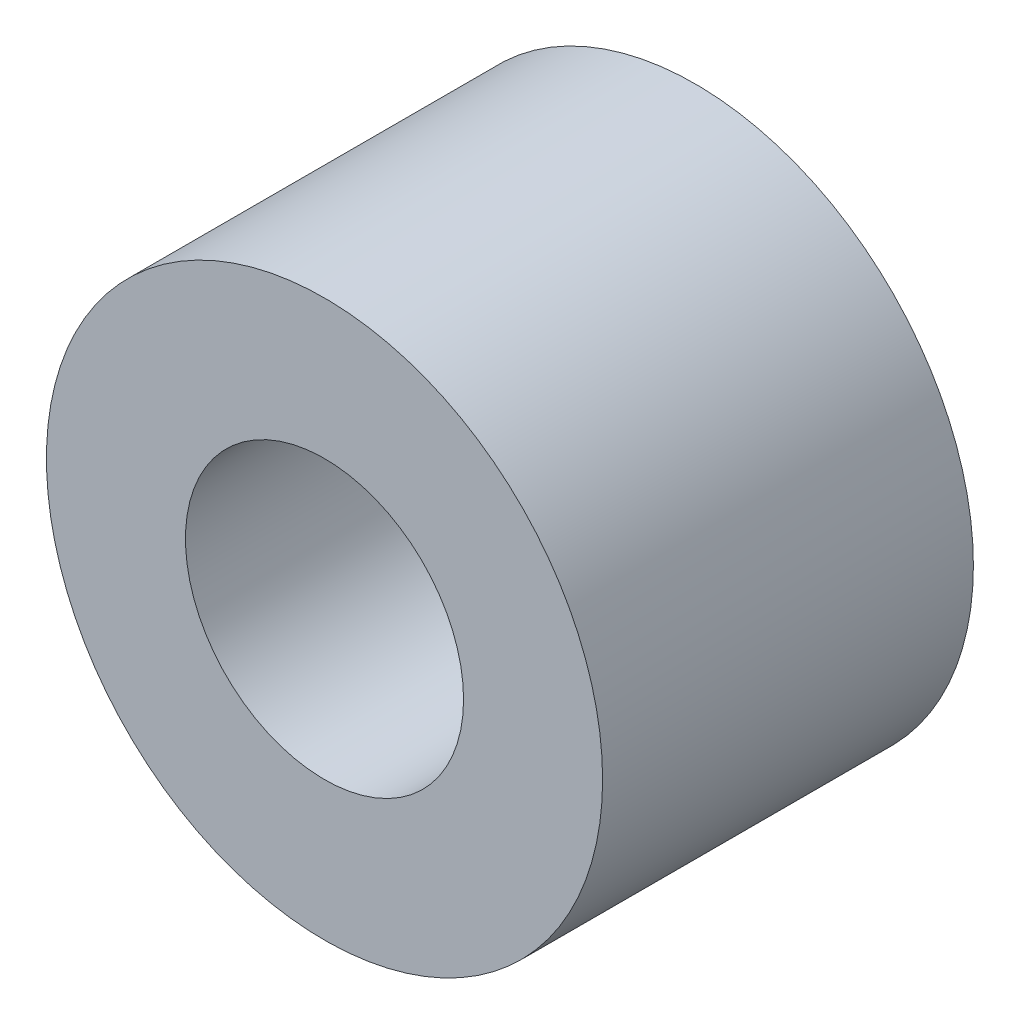
ISO-10303-21;
HEADER;
FILE_DESCRIPTION(('STEP AP214'),'2;1');
FILE_NAME('part.step','',(''),(''),'','','');
FILE_SCHEMA(('AUTOMOTIVE_DESIGN { 1 0 10303 214 1 1 1 1 }'));
ENDSEC;
DATA;
#1=APPLICATION_CONTEXT('core data for automotive mechanical design processes');
#2=APPLICATION_PROTOCOL_DEFINITION('international standard','automotive_design',2000,#1);
#3=PRODUCT_CONTEXT('',#1,'mechanical');
#4=PRODUCT('Part','Part','',(#3));
#5=PRODUCT_RELATED_PRODUCT_CATEGORY('part','',(#4));
#6=PRODUCT_DEFINITION_FORMATION('','',#4);
#7=PRODUCT_DEFINITION_CONTEXT('part definition',#1,'design');
#8=PRODUCT_DEFINITION('design','',#6,#7);
#9=PRODUCT_DEFINITION_SHAPE('','',#8);
#10=(LENGTH_UNIT() NAMED_UNIT(*) SI_UNIT(.MILLI.,.METRE.));
#11=(NAMED_UNIT(*) PLANE_ANGLE_UNIT() SI_UNIT($,.RADIAN.));
#12=(NAMED_UNIT(*) SI_UNIT($,.STERADIAN.) SOLID_ANGLE_UNIT());
#13=UNCERTAINTY_MEASURE_WITH_UNIT(LENGTH_MEASURE(1.E-05),#10,'distance_accuracy_value','');
#14=(GEOMETRIC_REPRESENTATION_CONTEXT(3) GLOBAL_UNCERTAINTY_ASSIGNED_CONTEXT((#13)) GLOBAL_UNIT_ASSIGNED_CONTEXT((#10,
#11,#12)) REPRESENTATION_CONTEXT('',''));
#15=CARTESIAN_POINT('',(0.,0.,0.));
#16=DIRECTION('',(0.,0.,1.));
#17=DIRECTION('',(1.,0.,0.));
#18=AXIS2_PLACEMENT_3D('',#15,#16,#17);
#19=CARTESIAN_POINT('',(-80.,0.00299999999998912,4.));
#20=DIRECTION('',(0.,0.,1.));
#21=DIRECTION('',(1.,0.,0.));
#22=AXIS2_PLACEMENT_3D('',#19,#20,#21);
#23=PLANE('',#22);
#24=CARTESIAN_POINT('',(-80.,0.00299999999998912,4.));
#25=DIRECTION('',(0.,0.,1.));
#26=DIRECTION('',(1.,0.,0.));
#27=AXIS2_PLACEMENT_3D('',#24,#25,#26);
#28=CIRCLE('',#27,3.00000000000001);
#29=CARTESIAN_POINT('',(-77.,0.00299999999998912,4.));
#30=VERTEX_POINT('',#29);
#31=EDGE_CURVE('E10',#30,#30,#28,.T.);
#32=ORIENTED_EDGE('',*,*,#31,.T.);
#33=EDGE_LOOP('',(#32));
#34=FACE_BOUND('',#33,.T.);
#35=CARTESIAN_POINT('',(-80.,0.00299999999998912,4.));
#36=DIRECTION('',(0.,0.,1.));
#37=DIRECTION('',(1.,0.,0.));
#38=AXIS2_PLACEMENT_3D('',#35,#36,#37);
#39=CIRCLE('',#38,1.50000000000001);
#40=CARTESIAN_POINT('',(-78.5,0.00299999999998912,4.));
#41=VERTEX_POINT('',#40);
#42=EDGE_CURVE('E44',#41,#41,#39,.T.);
#43=ORIENTED_EDGE('',*,*,#42,.F.);
#44=EDGE_LOOP('',(#43));
#45=FACE_BOUND('',#44,.T.);
#46=ADVANCED_FACE('F33',(#34,#45),#23,.T.);
#47=CARTESIAN_POINT('',(-80.,0.00299999999998912,0.));
#48=DIRECTION('',(0.,0.,1.));
#49=DIRECTION('',(1.,0.,0.));
#50=AXIS2_PLACEMENT_3D('',#47,#48,#49);
#51=PLANE('',#50);
#52=CARTESIAN_POINT('',(-80.,0.00299999999998912,0.));
#53=DIRECTION('',(0.,0.,1.));
#54=DIRECTION('',(1.,0.,0.));
#55=AXIS2_PLACEMENT_3D('',#52,#53,#54);
#56=CIRCLE('',#55,3.00000000000001);
#57=CARTESIAN_POINT('',(-77.,0.00299999999998912,0.));
#58=VERTEX_POINT('',#57);
#59=EDGE_CURVE('E37',#58,#58,#56,.T.);
#60=ORIENTED_EDGE('',*,*,#59,.F.);
#61=EDGE_LOOP('',(#60));
#62=FACE_BOUND('',#61,.T.);
#63=CARTESIAN_POINT('',(-80.,0.00299999999998912,0.));
#64=DIRECTION('',(0.,0.,1.));
#65=DIRECTION('',(1.,0.,0.));
#66=AXIS2_PLACEMENT_3D('',#63,#64,#65);
#67=CIRCLE('',#66,1.50000000000001);
#68=CARTESIAN_POINT('',(-78.5,0.00299999999998912,0.));
#69=VERTEX_POINT('',#68);
#70=EDGE_CURVE('E46',#69,#69,#67,.T.);
#71=ORIENTED_EDGE('',*,*,#70,.T.);
#72=EDGE_LOOP('',(#71));
#73=FACE_BOUND('',#72,.T.);
#74=ADVANCED_FACE('F56',(#62,#73),#51,.F.);
#75=CARTESIAN_POINT('',(-80.,0.00299999999998912,4.));
#76=DIRECTION('',(0.,0.,-1.));
#77=DIRECTION('',(-1.,0.,0.));
#78=AXIS2_PLACEMENT_3D('',#75,#76,#77);
#79=CYLINDRICAL_SURFACE('',#78,3.00000000000001);
#80=ORIENTED_EDGE('',*,*,#31,.F.);
#81=EDGE_LOOP('',(#80));
#82=FACE_BOUND('',#81,.T.);
#83=ORIENTED_EDGE('',*,*,#59,.T.);
#84=EDGE_LOOP('',(#83));
#85=FACE_BOUND('',#84,.T.);
#86=ADVANCED_FACE('F35',(#82,#85),#79,.T.);
#87=CARTESIAN_POINT('',(-80.,0.00299999999998912,4.));
#88=DIRECTION('',(0.,0.,-1.));
#89=DIRECTION('',(-1.,0.,0.));
#90=AXIS2_PLACEMENT_3D('',#87,#88,#89);
#91=CYLINDRICAL_SURFACE('',#90,1.50000000000001);
#92=ORIENTED_EDGE('',*,*,#42,.T.);
#93=EDGE_LOOP('',(#92));
#94=FACE_BOUND('',#93,.T.);
#95=ORIENTED_EDGE('',*,*,#70,.F.);
#96=EDGE_LOOP('',(#95));
#97=FACE_BOUND('',#96,.T.);
#98=ADVANCED_FACE('F52',(#94,#97),#91,.F.);
#99=CLOSED_SHELL('',(#46,#74,#86,#98));
#100=MANIFOLD_SOLID_BREP('B2',#99);
#101=ADVANCED_BREP_SHAPE_REPRESENTATION('',(#18,#100),#14);
#102=SHAPE_DEFINITION_REPRESENTATION(#9,#101);
ENDSEC;
END-ISO-10303-21;
